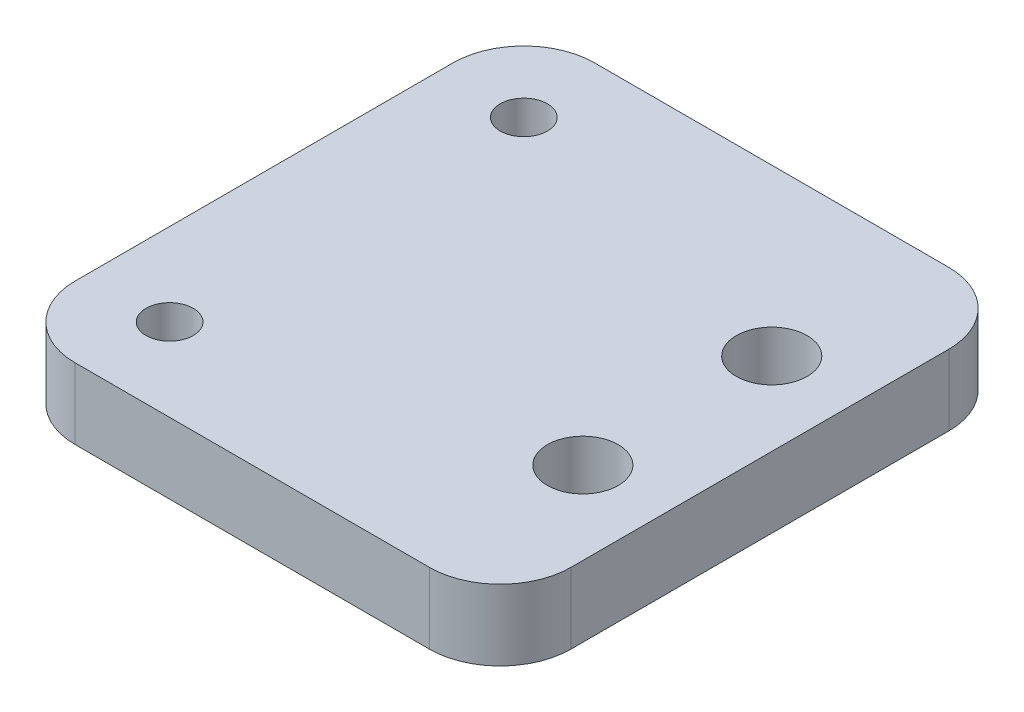
ISO-10303-21;
HEADER;
FILE_DESCRIPTION(('STEP AP214'),'2;1');
FILE_NAME('part.step','',(''),(''),'','','');
FILE_SCHEMA(('AUTOMOTIVE_DESIGN { 1 0 10303 214 1 1 1 1 }'));
ENDSEC;
DATA;
#1=APPLICATION_CONTEXT('core data for automotive mechanical design processes');
#2=APPLICATION_PROTOCOL_DEFINITION('international standard','automotive_design',2000,#1);
#3=PRODUCT_CONTEXT('',#1,'mechanical');
#4=PRODUCT('Part','Part','',(#3));
#5=PRODUCT_RELATED_PRODUCT_CATEGORY('part','',(#4));
#6=PRODUCT_DEFINITION_FORMATION('','',#4);
#7=PRODUCT_DEFINITION_CONTEXT('part definition',#1,'design');
#8=PRODUCT_DEFINITION('design','',#6,#7);
#9=PRODUCT_DEFINITION_SHAPE('','',#8);
#10=(LENGTH_UNIT() NAMED_UNIT(*) SI_UNIT(.MILLI.,.METRE.));
#11=(NAMED_UNIT(*) PLANE_ANGLE_UNIT() SI_UNIT($,.RADIAN.));
#12=(NAMED_UNIT(*) SI_UNIT($,.STERADIAN.) SOLID_ANGLE_UNIT());
#13=UNCERTAINTY_MEASURE_WITH_UNIT(LENGTH_MEASURE(1.E-05),#10,'distance_accuracy_value','');
#14=(GEOMETRIC_REPRESENTATION_CONTEXT(3) GLOBAL_UNCERTAINTY_ASSIGNED_CONTEXT((#13)) GLOBAL_UNIT_ASSIGNED_CONTEXT((#10,
#11,#12)) REPRESENTATION_CONTEXT('',''));
#15=CARTESIAN_POINT('',(0.,0.,0.));
#16=DIRECTION('',(0.,0.,1.));
#17=DIRECTION('',(1.,0.,0.));
#18=AXIS2_PLACEMENT_3D('',#15,#16,#17);
#19=CARTESIAN_POINT('',(0.,3.,11.));
#20=DIRECTION('',(0.,0.,-1.));
#21=DIRECTION('',(-1.,0.,0.));
#22=AXIS2_PLACEMENT_3D('',#19,#20,#21);
#23=PLANE('',#22);
#24=DIRECTION('',(1.,0.,0.));
#25=VECTOR('',#24,1.);
#26=CARTESIAN_POINT('',(0.,3.,11.));
#27=LINE('',#26,#25);
#28=CARTESIAN_POINT('',(-0.5,3.,11.));
#29=VERTEX_POINT('',#28);
#30=CARTESIAN_POINT('',(14.5,3.,11.));
#31=VERTEX_POINT('',#30);
#32=EDGE_CURVE('E215',#29,#31,#27,.T.);
#33=ORIENTED_EDGE('',*,*,#32,.F.);
#34=DIRECTION('',(0.,-1.,0.));
#35=VECTOR('',#34,1.);
#36=CARTESIAN_POINT('',(-0.5,0.,11.));
#37=LINE('',#36,#35);
#38=CARTESIAN_POINT('',(-0.5,0.,11.));
#39=VERTEX_POINT('',#38);
#40=EDGE_CURVE('E180',#29,#39,#37,.T.);
#41=ORIENTED_EDGE('',*,*,#40,.T.);
#42=DIRECTION('',(1.,0.,0.));
#43=VECTOR('',#42,1.);
#44=CARTESIAN_POINT('',(0.,0.,11.));
#45=LINE('',#44,#43);
#46=CARTESIAN_POINT('',(14.5,0.,11.));
#47=VERTEX_POINT('',#46);
#48=EDGE_CURVE('E116',#39,#47,#45,.T.);
#49=ORIENTED_EDGE('',*,*,#48,.T.);
#50=DIRECTION('',(0.,-1.,0.));
#51=VECTOR('',#50,1.);
#52=CARTESIAN_POINT('',(14.5,3.,11.));
#53=LINE('',#52,#51);
#54=EDGE_CURVE('E177',#47,#31,#53,.F.);
#55=ORIENTED_EDGE('',*,*,#54,.T.);
#56=EDGE_LOOP('',(#33,#41,#49,#55));
#57=FACE_BOUND('',#56,.T.);
#58=ADVANCED_FACE('F44',(#57),#23,.F.);
#59=CARTESIAN_POINT('',(17.5,3.,0.));
#60=DIRECTION('',(1.,0.,0.));
#61=DIRECTION('',(0.,0.,-1.));
#62=AXIS2_PLACEMENT_3D('',#59,#60,#61);
#63=PLANE('',#62);
#64=DIRECTION('',(0.,0.,1.));
#65=VECTOR('',#64,1.);
#66=CARTESIAN_POINT('',(17.5,0.,0.));
#67=LINE('',#66,#65);
#68=CARTESIAN_POINT('',(17.5,0.,-8.00000000000001));
#69=VERTEX_POINT('',#68);
#70=CARTESIAN_POINT('',(17.5,0.,7.99999999999999));
#71=VERTEX_POINT('',#70);
#72=EDGE_CURVE('E187',#69,#71,#67,.T.);
#73=ORIENTED_EDGE('',*,*,#72,.F.);
#74=DIRECTION('',(0.,-1.,0.));
#75=VECTOR('',#74,1.);
#76=CARTESIAN_POINT('',(17.5,3.,-8.00000000000001));
#77=LINE('',#76,#75);
#78=CARTESIAN_POINT('',(17.5,3.,-8.00000000000001));
#79=VERTEX_POINT('',#78);
#80=EDGE_CURVE('E11',#69,#79,#77,.F.);
#81=ORIENTED_EDGE('',*,*,#80,.T.);
#82=DIRECTION('',(0.,0.,1.));
#83=VECTOR('',#82,1.);
#84=CARTESIAN_POINT('',(17.5,3.,0.));
#85=LINE('',#84,#83);
#86=CARTESIAN_POINT('',(17.5,3.,7.99999999999999));
#87=VERTEX_POINT('',#86);
#88=EDGE_CURVE('E188',#79,#87,#85,.T.);
#89=ORIENTED_EDGE('',*,*,#88,.T.);
#90=DIRECTION('',(0.,-1.,0.));
#91=VECTOR('',#90,1.);
#92=CARTESIAN_POINT('',(17.5,0.,7.99999999999999));
#93=LINE('',#92,#91);
#94=EDGE_CURVE('E53',#87,#71,#93,.T.);
#95=ORIENTED_EDGE('',*,*,#94,.T.);
#96=EDGE_LOOP('',(#73,#81,#89,#95));
#97=FACE_BOUND('',#96,.T.);
#98=ADVANCED_FACE('F186',(#97),#63,.T.);
#99=CARTESIAN_POINT('',(0.,3.,-11.));
#100=DIRECTION('',(0.,0.,-1.));
#101=DIRECTION('',(-1.,0.,0.));
#102=AXIS2_PLACEMENT_3D('',#99,#100,#101);
#103=PLANE('',#102);
#104=DIRECTION('',(1.,0.,0.));
#105=VECTOR('',#104,1.);
#106=CARTESIAN_POINT('',(0.,0.,-11.));
#107=LINE('',#106,#105);
#108=CARTESIAN_POINT('',(-0.5,0.,-11.));
#109=VERTEX_POINT('',#108);
#110=CARTESIAN_POINT('',(14.5,0.,-11.));
#111=VERTEX_POINT('',#110);
#112=EDGE_CURVE('E135',#109,#111,#107,.T.);
#113=ORIENTED_EDGE('',*,*,#112,.F.);
#114=DIRECTION('',(0.,-1.,0.));
#115=VECTOR('',#114,1.);
#116=CARTESIAN_POINT('',(-0.5,3.,-11.));
#117=LINE('',#116,#115);
#118=CARTESIAN_POINT('',(-0.5,3.,-11.));
#119=VERTEX_POINT('',#118);
#120=EDGE_CURVE('E164',#109,#119,#117,.F.);
#121=ORIENTED_EDGE('',*,*,#120,.T.);
#122=DIRECTION('',(1.,0.,0.));
#123=VECTOR('',#122,1.);
#124=CARTESIAN_POINT('',(0.,3.,-11.));
#125=LINE('',#124,#123);
#126=CARTESIAN_POINT('',(14.5,3.,-11.));
#127=VERTEX_POINT('',#126);
#128=EDGE_CURVE('E222',#119,#127,#125,.T.);
#129=ORIENTED_EDGE('',*,*,#128,.T.);
#130=DIRECTION('',(0.,-1.,0.));
#131=VECTOR('',#130,1.);
#132=CARTESIAN_POINT('',(14.5,3.,-11.));
#133=LINE('',#132,#131);
#134=EDGE_CURVE('E160',#127,#111,#133,.T.);
#135=ORIENTED_EDGE('',*,*,#134,.T.);
#136=EDGE_LOOP('',(#113,#121,#129,#135));
#137=FACE_BOUND('',#136,.T.);
#138=ADVANCED_FACE('F259',(#137),#103,.T.);
#139=CARTESIAN_POINT('',(14.,3.,4.));
#140=DIRECTION('',(0.,-1.,0.));
#141=DIRECTION('',(0.,0.,-1.));
#142=AXIS2_PLACEMENT_3D('',#139,#140,#141);
#143=CYLINDRICAL_SURFACE('',#142,1.5);
#144=CARTESIAN_POINT('',(14.,3.,4.));
#145=DIRECTION('',(0.,1.,0.));
#146=DIRECTION('',(0.,0.,1.));
#147=AXIS2_PLACEMENT_3D('',#144,#145,#146);
#148=CIRCLE('',#147,1.5);
#149=CARTESIAN_POINT('',(14.,3.,5.5));
#150=VERTEX_POINT('',#149);
#151=EDGE_CURVE('E148',#150,#150,#148,.T.);
#152=ORIENTED_EDGE('',*,*,#151,.T.);
#153=EDGE_LOOP('',(#152));
#154=FACE_BOUND('',#153,.T.);
#155=CARTESIAN_POINT('',(14.,0.,4.));
#156=DIRECTION('',(0.,1.,0.));
#157=DIRECTION('',(0.,0.,1.));
#158=AXIS2_PLACEMENT_3D('',#155,#156,#157);
#159=CIRCLE('',#158,1.5);
#160=CARTESIAN_POINT('',(14.,0.,5.5));
#161=VERTEX_POINT('',#160);
#162=EDGE_CURVE('E134',#161,#161,#159,.T.);
#163=ORIENTED_EDGE('',*,*,#162,.F.);
#164=EDGE_LOOP('',(#163));
#165=FACE_BOUND('',#164,.T.);
#166=ADVANCED_FACE('F251',(#154,#165),#143,.F.);
#167=CARTESIAN_POINT('',(-3.5,3.,0.));
#168=DIRECTION('',(-1.,0.,0.));
#169=DIRECTION('',(0.,0.,1.));
#170=AXIS2_PLACEMENT_3D('',#167,#168,#169);
#171=PLANE('',#170);
#172=DIRECTION('',(0.,0.,-1.));
#173=VECTOR('',#172,1.);
#174=CARTESIAN_POINT('',(-3.5,3.,0.));
#175=LINE('',#174,#173);
#176=CARTESIAN_POINT('',(-3.5,3.,8.));
#177=VERTEX_POINT('',#176);
#178=CARTESIAN_POINT('',(-3.5,3.,-8.));
#179=VERTEX_POINT('',#178);
#180=EDGE_CURVE('E226',#177,#179,#175,.T.);
#181=ORIENTED_EDGE('',*,*,#180,.T.);
#182=DIRECTION('',(0.,-1.,0.));
#183=VECTOR('',#182,1.);
#184=CARTESIAN_POINT('',(-3.5,3.,-8.));
#185=LINE('',#184,#183);
#186=CARTESIAN_POINT('',(-3.5,0.,-8.));
#187=VERTEX_POINT('',#186);
#188=EDGE_CURVE('E132',#179,#187,#185,.T.);
#189=ORIENTED_EDGE('',*,*,#188,.T.);
#190=DIRECTION('',(0.,0.,-1.));
#191=VECTOR('',#190,1.);
#192=CARTESIAN_POINT('',(-3.5,0.,0.));
#193=LINE('',#192,#191);
#194=CARTESIAN_POINT('',(-3.5,0.,8.));
#195=VERTEX_POINT('',#194);
#196=EDGE_CURVE('E114',#195,#187,#193,.T.);
#197=ORIENTED_EDGE('',*,*,#196,.F.);
#198=DIRECTION('',(0.,-1.,0.));
#199=VECTOR('',#198,1.);
#200=CARTESIAN_POINT('',(-3.5,3.,8.));
#201=LINE('',#200,#199);
#202=EDGE_CURVE('E129',#195,#177,#201,.F.);
#203=ORIENTED_EDGE('',*,*,#202,.T.);
#204=EDGE_LOOP('',(#181,#189,#197,#203));
#205=FACE_BOUND('',#204,.T.);
#206=ADVANCED_FACE('F128',(#205),#171,.T.);
#207=CARTESIAN_POINT('',(0.,3.,-7.5));
#208=DIRECTION('',(0.,-1.,0.));
#209=DIRECTION('',(0.,0.,-1.));
#210=AXIS2_PLACEMENT_3D('',#207,#208,#209);
#211=CYLINDRICAL_SURFACE('',#210,1.);
#212=CARTESIAN_POINT('',(0.,3.,-7.5));
#213=DIRECTION('',(0.,1.,0.));
#214=DIRECTION('',(0.,0.,1.));
#215=AXIS2_PLACEMENT_3D('',#212,#213,#214);
#216=CIRCLE('',#215,1.);
#217=CARTESIAN_POINT('',(0.,3.,-6.5));
#218=VERTEX_POINT('',#217);
#219=EDGE_CURVE('E209',#218,#218,#216,.T.);
#220=ORIENTED_EDGE('',*,*,#219,.T.);
#221=EDGE_LOOP('',(#220));
#222=FACE_BOUND('',#221,.T.);
#223=CARTESIAN_POINT('',(0.,0.,-7.5));
#224=DIRECTION('',(0.,1.,0.));
#225=DIRECTION('',(0.,0.,1.));
#226=AXIS2_PLACEMENT_3D('',#223,#224,#225);
#227=CIRCLE('',#226,1.);
#228=CARTESIAN_POINT('',(0.,0.,-6.5));
#229=VERTEX_POINT('',#228);
#230=EDGE_CURVE('E196',#229,#229,#227,.T.);
#231=ORIENTED_EDGE('',*,*,#230,.F.);
#232=EDGE_LOOP('',(#231));
#233=FACE_BOUND('',#232,.T.);
#234=ADVANCED_FACE('F240',(#222,#233),#211,.F.);
#235=CARTESIAN_POINT('',(0.,3.,7.5));
#236=DIRECTION('',(0.,-1.,0.));
#237=DIRECTION('',(0.,0.,-1.));
#238=AXIS2_PLACEMENT_3D('',#235,#236,#237);
#239=CYLINDRICAL_SURFACE('',#238,1.);
#240=CARTESIAN_POINT('',(0.,3.,7.5));
#241=DIRECTION('',(0.,1.,0.));
#242=DIRECTION('',(0.,0.,1.));
#243=AXIS2_PLACEMENT_3D('',#240,#241,#242);
#244=CIRCLE('',#243,1.);
#245=CARTESIAN_POINT('',(0.,3.,8.5));
#246=VERTEX_POINT('',#245);
#247=EDGE_CURVE('E204',#246,#246,#244,.T.);
#248=ORIENTED_EDGE('',*,*,#247,.T.);
#249=EDGE_LOOP('',(#248));
#250=FACE_BOUND('',#249,.T.);
#251=CARTESIAN_POINT('',(0.,0.,7.5));
#252=DIRECTION('',(0.,1.,0.));
#253=DIRECTION('',(0.,0.,1.));
#254=AXIS2_PLACEMENT_3D('',#251,#252,#253);
#255=CIRCLE('',#254,1.);
#256=CARTESIAN_POINT('',(0.,0.,8.5));
#257=VERTEX_POINT('',#256);
#258=EDGE_CURVE('E232',#257,#257,#255,.T.);
#259=ORIENTED_EDGE('',*,*,#258,.F.);
#260=EDGE_LOOP('',(#259));
#261=FACE_BOUND('',#260,.T.);
#262=ADVANCED_FACE('F242',(#250,#261),#239,.F.);
#263=CARTESIAN_POINT('',(14.,3.,-4.));
#264=DIRECTION('',(0.,-1.,0.));
#265=DIRECTION('',(0.,0.,-1.));
#266=AXIS2_PLACEMENT_3D('',#263,#264,#265);
#267=CYLINDRICAL_SURFACE('',#266,1.5);
#268=CARTESIAN_POINT('',(14.,3.,-4.));
#269=DIRECTION('',(0.,1.,0.));
#270=DIRECTION('',(0.,0.,1.));
#271=AXIS2_PLACEMENT_3D('',#268,#269,#270);
#272=CIRCLE('',#271,1.5);
#273=CARTESIAN_POINT('',(14.,3.,-2.5));
#274=VERTEX_POINT('',#273);
#275=EDGE_CURVE('E141',#274,#274,#272,.T.);
#276=ORIENTED_EDGE('',*,*,#275,.T.);
#277=EDGE_LOOP('',(#276));
#278=FACE_BOUND('',#277,.T.);
#279=CARTESIAN_POINT('',(14.,0.,-4.));
#280=DIRECTION('',(0.,1.,0.));
#281=DIRECTION('',(0.,0.,1.));
#282=AXIS2_PLACEMENT_3D('',#279,#280,#281);
#283=CIRCLE('',#282,1.5);
#284=CARTESIAN_POINT('',(14.,0.,-2.5));
#285=VERTEX_POINT('',#284);
#286=EDGE_CURVE('E151',#285,#285,#283,.T.);
#287=ORIENTED_EDGE('',*,*,#286,.F.);
#288=EDGE_LOOP('',(#287));
#289=FACE_BOUND('',#288,.T.);
#290=ADVANCED_FACE('F249',(#278,#289),#267,.F.);
#291=CARTESIAN_POINT('',(0.,3.,0.));
#292=DIRECTION('',(0.,1.,0.));
#293=DIRECTION('',(0.,0.,1.));
#294=AXIS2_PLACEMENT_3D('',#291,#292,#293);
#295=PLANE('',#294);
#296=ORIENTED_EDGE('',*,*,#247,.F.);
#297=EDGE_LOOP('',(#296));
#298=FACE_BOUND('',#297,.T.);
#299=ORIENTED_EDGE('',*,*,#219,.F.);
#300=EDGE_LOOP('',(#299));
#301=FACE_BOUND('',#300,.T.);
#302=ORIENTED_EDGE('',*,*,#128,.F.);
#303=CARTESIAN_POINT('',(-0.5,3.,-8.));
#304=DIRECTION('',(0.,1.,0.));
#305=DIRECTION('',(0.,0.,1.));
#306=AXIS2_PLACEMENT_3D('',#303,#304,#305);
#307=CIRCLE('',#306,3.);
#308=EDGE_CURVE('E174',#119,#179,#307,.T.);
#309=ORIENTED_EDGE('',*,*,#308,.T.);
#310=ORIENTED_EDGE('',*,*,#180,.F.);
#311=CARTESIAN_POINT('',(-0.5,3.,8.));
#312=DIRECTION('',(0.,1.,0.));
#313=DIRECTION('',(0.,0.,1.));
#314=AXIS2_PLACEMENT_3D('',#311,#312,#313);
#315=CIRCLE('',#314,3.);
#316=EDGE_CURVE('E139',#177,#29,#315,.T.);
#317=ORIENTED_EDGE('',*,*,#316,.T.);
#318=ORIENTED_EDGE('',*,*,#32,.T.);
#319=CARTESIAN_POINT('',(14.5,3.,8.));
#320=DIRECTION('',(0.,1.,0.));
#321=DIRECTION('',(0.,0.,1.));
#322=AXIS2_PLACEMENT_3D('',#319,#320,#321);
#323=CIRCLE('',#322,3.);
#324=EDGE_CURVE('E60',#31,#87,#323,.T.);
#325=ORIENTED_EDGE('',*,*,#324,.T.);
#326=ORIENTED_EDGE('',*,*,#88,.F.);
#327=CARTESIAN_POINT('',(14.5,3.,-8.));
#328=DIRECTION('',(0.,1.,0.));
#329=DIRECTION('',(0.,0.,1.));
#330=AXIS2_PLACEMENT_3D('',#327,#328,#329);
#331=CIRCLE('',#330,3.);
#332=EDGE_CURVE('E169',#79,#127,#331,.T.);
#333=ORIENTED_EDGE('',*,*,#332,.T.);
#334=EDGE_LOOP('',(#302,#309,#310,#317,#318,#325,#326,#333));
#335=FACE_BOUND('',#334,.T.);
#336=ORIENTED_EDGE('',*,*,#151,.F.);
#337=EDGE_LOOP('',(#336));
#338=FACE_BOUND('',#337,.T.);
#339=ORIENTED_EDGE('',*,*,#275,.F.);
#340=EDGE_LOOP('',(#339));
#341=FACE_BOUND('',#340,.T.);
#342=ADVANCED_FACE('F271',(#298,#301,#335,#338,#341),#295,.T.);
#343=CARTESIAN_POINT('',(0.,0.,0.));
#344=DIRECTION('',(0.,1.,0.));
#345=DIRECTION('',(0.,0.,1.));
#346=AXIS2_PLACEMENT_3D('',#343,#344,#345);
#347=PLANE('',#346);
#348=ORIENTED_EDGE('',*,*,#258,.T.);
#349=EDGE_LOOP('',(#348));
#350=FACE_BOUND('',#349,.T.);
#351=ORIENTED_EDGE('',*,*,#230,.T.);
#352=EDGE_LOOP('',(#351));
#353=FACE_BOUND('',#352,.T.);
#354=ORIENTED_EDGE('',*,*,#196,.T.);
#355=CARTESIAN_POINT('',(-0.5,0.,-8.));
#356=DIRECTION('',(0.,1.,0.));
#357=DIRECTION('',(0.,0.,1.));
#358=AXIS2_PLACEMENT_3D('',#355,#356,#357);
#359=CIRCLE('',#358,3.);
#360=EDGE_CURVE('E122',#187,#109,#359,.F.);
#361=ORIENTED_EDGE('',*,*,#360,.T.);
#362=ORIENTED_EDGE('',*,*,#112,.T.);
#363=CARTESIAN_POINT('',(14.5,0.,-8.));
#364=DIRECTION('',(0.,1.,0.));
#365=DIRECTION('',(0.,0.,1.));
#366=AXIS2_PLACEMENT_3D('',#363,#364,#365);
#367=CIRCLE('',#366,3.);
#368=EDGE_CURVE('E123',#111,#69,#367,.F.);
#369=ORIENTED_EDGE('',*,*,#368,.T.);
#370=ORIENTED_EDGE('',*,*,#72,.T.);
#371=CARTESIAN_POINT('',(14.5,0.,8.));
#372=DIRECTION('',(0.,1.,0.));
#373=DIRECTION('',(0.,0.,1.));
#374=AXIS2_PLACEMENT_3D('',#371,#372,#373);
#375=CIRCLE('',#374,3.);
#376=EDGE_CURVE('E145',#71,#47,#375,.F.);
#377=ORIENTED_EDGE('',*,*,#376,.T.);
#378=ORIENTED_EDGE('',*,*,#48,.F.);
#379=CARTESIAN_POINT('',(-0.5,0.,8.));
#380=DIRECTION('',(0.,1.,0.));
#381=DIRECTION('',(0.,0.,1.));
#382=AXIS2_PLACEMENT_3D('',#379,#380,#381);
#383=CIRCLE('',#382,3.);
#384=EDGE_CURVE('E110',#39,#195,#383,.F.);
#385=ORIENTED_EDGE('',*,*,#384,.T.);
#386=EDGE_LOOP('',(#354,#361,#362,#369,#370,#377,#378,#385));
#387=FACE_BOUND('',#386,.T.);
#388=ORIENTED_EDGE('',*,*,#162,.T.);
#389=EDGE_LOOP('',(#388));
#390=FACE_BOUND('',#389,.T.);
#391=ORIENTED_EDGE('',*,*,#286,.T.);
#392=EDGE_LOOP('',(#391));
#393=FACE_BOUND('',#392,.T.);
#394=ADVANCED_FACE('F112',(#350,#353,#387,#390,#393),#347,.F.);
#395=CARTESIAN_POINT('',(-0.5,3.,-8.));
#396=DIRECTION('',(0.,-1.,0.));
#397=DIRECTION('',(0.,0.,-1.));
#398=AXIS2_PLACEMENT_3D('',#395,#396,#397);
#399=CYLINDRICAL_SURFACE('',#398,3.);
#400=ORIENTED_EDGE('',*,*,#308,.F.);
#401=ORIENTED_EDGE('',*,*,#120,.F.);
#402=ORIENTED_EDGE('',*,*,#360,.F.);
#403=ORIENTED_EDGE('',*,*,#188,.F.);
#404=EDGE_LOOP('',(#400,#401,#402,#403));
#405=FACE_BOUND('',#404,.T.);
#406=ADVANCED_FACE('F275',(#405),#399,.T.);
#407=CARTESIAN_POINT('',(-0.5,3.,8.));
#408=DIRECTION('',(0.,1.,0.));
#409=DIRECTION('',(0.,0.,1.));
#410=AXIS2_PLACEMENT_3D('',#407,#408,#409);
#411=CYLINDRICAL_SURFACE('',#410,3.);
#412=ORIENTED_EDGE('',*,*,#316,.F.);
#413=ORIENTED_EDGE('',*,*,#202,.F.);
#414=ORIENTED_EDGE('',*,*,#384,.F.);
#415=ORIENTED_EDGE('',*,*,#40,.F.);
#416=EDGE_LOOP('',(#412,#413,#414,#415));
#417=FACE_BOUND('',#416,.T.);
#418=ADVANCED_FACE('F138',(#417),#411,.T.);
#419=CARTESIAN_POINT('',(14.5,3.,-8.));
#420=DIRECTION('',(0.,-1.,0.));
#421=DIRECTION('',(0.,0.,-1.));
#422=AXIS2_PLACEMENT_3D('',#419,#420,#421);
#423=CYLINDRICAL_SURFACE('',#422,3.);
#424=ORIENTED_EDGE('',*,*,#332,.F.);
#425=ORIENTED_EDGE('',*,*,#80,.F.);
#426=ORIENTED_EDGE('',*,*,#368,.F.);
#427=ORIENTED_EDGE('',*,*,#134,.F.);
#428=EDGE_LOOP('',(#424,#425,#426,#427));
#429=FACE_BOUND('',#428,.T.);
#430=ADVANCED_FACE('F297',(#429),#423,.T.);
#431=CARTESIAN_POINT('',(14.5,3.,8.));
#432=DIRECTION('',(0.,1.,0.));
#433=DIRECTION('',(0.,0.,1.));
#434=AXIS2_PLACEMENT_3D('',#431,#432,#433);
#435=CYLINDRICAL_SURFACE('',#434,3.);
#436=ORIENTED_EDGE('',*,*,#324,.F.);
#437=ORIENTED_EDGE('',*,*,#54,.F.);
#438=ORIENTED_EDGE('',*,*,#376,.F.);
#439=ORIENTED_EDGE('',*,*,#94,.F.);
#440=EDGE_LOOP('',(#436,#437,#438,#439));
#441=FACE_BOUND('',#440,.T.);
#442=ADVANCED_FACE('F46',(#441),#435,.T.);
#443=CLOSED_SHELL('',(#58,#98,#138,#166,#206,#234,#262,#290,#342,#394,#406,#418,#430,#442));
#444=MANIFOLD_SOLID_BREP('B2',#443);
#445=ADVANCED_BREP_SHAPE_REPRESENTATION('',(#18,#444),#14);
#446=SHAPE_DEFINITION_REPRESENTATION(#9,#445);
ENDSEC;
END-ISO-10303-21;
